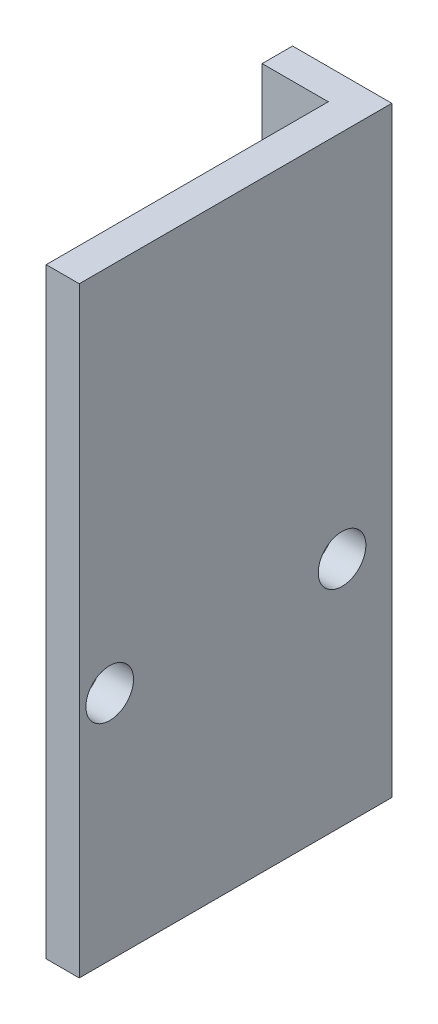
ISO-10303-21;
HEADER;
FILE_DESCRIPTION(('STEP AP214'),'2;1');
FILE_NAME('part.step','',(''),(''),'','','');
FILE_SCHEMA(('AUTOMOTIVE_DESIGN { 1 0 10303 214 1 1 1 1 }'));
ENDSEC;
DATA;
#1=APPLICATION_CONTEXT('core data for automotive mechanical design processes');
#2=APPLICATION_PROTOCOL_DEFINITION('international standard','automotive_design',2000,#1);
#3=PRODUCT_CONTEXT('',#1,'mechanical');
#4=PRODUCT('Part','Part','',(#3));
#5=PRODUCT_RELATED_PRODUCT_CATEGORY('part','',(#4));
#6=PRODUCT_DEFINITION_FORMATION('','',#4);
#7=PRODUCT_DEFINITION_CONTEXT('part definition',#1,'design');
#8=PRODUCT_DEFINITION('design','',#6,#7);
#9=PRODUCT_DEFINITION_SHAPE('','',#8);
#10=(LENGTH_UNIT() NAMED_UNIT(*) SI_UNIT(.MILLI.,.METRE.));
#11=(NAMED_UNIT(*) PLANE_ANGLE_UNIT() SI_UNIT($,.RADIAN.));
#12=(NAMED_UNIT(*) SI_UNIT($,.STERADIAN.) SOLID_ANGLE_UNIT());
#13=UNCERTAINTY_MEASURE_WITH_UNIT(LENGTH_MEASURE(1.E-05),#10,'distance_accuracy_value','');
#14=(GEOMETRIC_REPRESENTATION_CONTEXT(3) GLOBAL_UNCERTAINTY_ASSIGNED_CONTEXT((#13)) GLOBAL_UNIT_ASSIGNED_CONTEXT((#10,
#11,#12)) REPRESENTATION_CONTEXT('',''));
#15=CARTESIAN_POINT('',(0.,0.,0.));
#16=DIRECTION('',(0.,0.,1.));
#17=DIRECTION('',(1.,0.,0.));
#18=AXIS2_PLACEMENT_3D('',#15,#16,#17);
#19=CARTESIAN_POINT('',(0.,28.8544,14.9987));
#20=DIRECTION('',(1.,0.,0.));
#21=DIRECTION('',(0.,0.,-1.));
#22=AXIS2_PLACEMENT_3D('',#19,#20,#21);
#23=PLANE('',#22);
#24=CARTESIAN_POINT('',(0.,22.225,27.0764));
#25=DIRECTION('',(1.,0.,0.));
#26=DIRECTION('',(0.,-1.,0.));
#27=AXIS2_PLACEMENT_3D('',#24,#25,#26);
#28=CIRCLE('',#27,2.286);
#29=CARTESIAN_POINT('',(0.,24.511,27.0764));
#30=VERTEX_POINT('',#29);
#31=EDGE_CURVE('E118',#30,#30,#28,.T.);
#32=ORIENTED_EDGE('',*,*,#31,.T.);
#33=EDGE_LOOP('',(#32));
#34=FACE_BOUND('',#33,.T.);
#35=CARTESIAN_POINT('',(0.,22.225,4.7752));
#36=DIRECTION('',(1.,0.,0.));
#37=DIRECTION('',(0.,-1.,0.));
#38=AXIS2_PLACEMENT_3D('',#35,#36,#37);
#39=CIRCLE('',#38,2.286);
#40=CARTESIAN_POINT('',(0.,24.511,4.7752));
#41=VERTEX_POINT('',#40);
#42=EDGE_CURVE('E87',#41,#41,#39,.T.);
#43=ORIENTED_EDGE('',*,*,#42,.T.);
#44=EDGE_LOOP('',(#43));
#45=FACE_BOUND('',#44,.T.);
#46=DIRECTION('',(0.,0.,-1.));
#47=VECTOR('',#46,1.);
#48=CARTESIAN_POINT('',(0.,29.7688,7.49935));
#49=LINE('',#48,#47);
#50=CARTESIAN_POINT('',(0.,29.7688,2.921));
#51=VERTEX_POINT('',#50);
#52=CARTESIAN_POINT('',(0.,29.7688,0.));
#53=VERTEX_POINT('',#52);
#54=EDGE_CURVE('E122',#51,#53,#49,.T.);
#55=ORIENTED_EDGE('',*,*,#54,.T.);
#56=DIRECTION('',(0.,1.,0.));
#57=VECTOR('',#56,1.);
#58=CARTESIAN_POINT('',(0.,0.,0.));
#59=LINE('',#58,#57);
#60=CARTESIAN_POINT('',(0.,0.,0.));
#61=VERTEX_POINT('',#60);
#62=EDGE_CURVE('E27',#61,#53,#59,.T.);
#63=ORIENTED_EDGE('',*,*,#62,.F.);
#64=DIRECTION('',(0.,0.,-1.));
#65=VECTOR('',#64,1.);
#66=CARTESIAN_POINT('',(0.,0.,29.9974));
#67=LINE('',#66,#65);
#68=CARTESIAN_POINT('',(0.,0.,29.9974));
#69=VERTEX_POINT('',#68);
#70=EDGE_CURVE('E110',#69,#61,#67,.T.);
#71=ORIENTED_EDGE('',*,*,#70,.F.);
#72=DIRECTION('',(0.,-1.,0.));
#73=VECTOR('',#72,1.);
#74=CARTESIAN_POINT('',(0.,57.7088,29.9974));
#75=LINE('',#74,#73);
#76=CARTESIAN_POINT('',(0.,57.7088,29.9974));
#77=VERTEX_POINT('',#76);
#78=EDGE_CURVE('E156',#77,#69,#75,.T.);
#79=ORIENTED_EDGE('',*,*,#78,.F.);
#80=DIRECTION('',(0.,0.,1.));
#81=VECTOR('',#80,1.);
#82=CARTESIAN_POINT('',(0.,57.7088,0.));
#83=LINE('',#82,#81);
#84=CARTESIAN_POINT('',(0.,57.7088,2.921));
#85=VERTEX_POINT('',#84);
#86=EDGE_CURVE('E128',#85,#77,#83,.T.);
#87=ORIENTED_EDGE('',*,*,#86,.F.);
#88=DIRECTION('',(0.,-1.,0.));
#89=VECTOR('',#88,1.);
#90=CARTESIAN_POINT('',(0.,29.3116,2.921));
#91=LINE('',#90,#89);
#92=EDGE_CURVE('E141',#85,#51,#91,.T.);
#93=ORIENTED_EDGE('',*,*,#92,.T.);
#94=EDGE_LOOP('',(#55,#63,#71,#79,#87,#93));
#95=FACE_BOUND('',#94,.T.);
#96=ADVANCED_FACE('F16',(#34,#45,#95),#23,.F.);
#97=CARTESIAN_POINT('',(3.175,28.8544,14.9987));
#98=DIRECTION('',(1.,0.,0.));
#99=DIRECTION('',(0.,0.,-1.));
#100=AXIS2_PLACEMENT_3D('',#97,#98,#99);
#101=PLANE('',#100);
#102=DIRECTION('',(0.,1.,0.));
#103=VECTOR('',#102,1.);
#104=CARTESIAN_POINT('',(3.175,0.,0.));
#105=LINE('',#104,#103);
#106=CARTESIAN_POINT('',(3.175,0.,0.));
#107=VERTEX_POINT('',#106);
#108=CARTESIAN_POINT('',(3.175,57.7088,0.));
#109=VERTEX_POINT('',#108);
#110=EDGE_CURVE('E10',#107,#109,#105,.T.);
#111=ORIENTED_EDGE('',*,*,#110,.T.);
#112=DIRECTION('',(0.,0.,1.));
#113=VECTOR('',#112,1.);
#114=CARTESIAN_POINT('',(3.175,57.7088,0.));
#115=LINE('',#114,#113);
#116=CARTESIAN_POINT('',(3.175,57.7088,29.9974));
#117=VERTEX_POINT('',#116);
#118=EDGE_CURVE('E131',#109,#117,#115,.T.);
#119=ORIENTED_EDGE('',*,*,#118,.T.);
#120=DIRECTION('',(0.,-1.,0.));
#121=VECTOR('',#120,1.);
#122=CARTESIAN_POINT('',(3.175,57.7088,29.9974));
#123=LINE('',#122,#121);
#124=CARTESIAN_POINT('',(3.175,0.,29.9974));
#125=VERTEX_POINT('',#124);
#126=EDGE_CURVE('E102',#117,#125,#123,.T.);
#127=ORIENTED_EDGE('',*,*,#126,.T.);
#128=DIRECTION('',(0.,0.,-1.));
#129=VECTOR('',#128,1.);
#130=CARTESIAN_POINT('',(3.175,0.,29.9974));
#131=LINE('',#130,#129);
#132=EDGE_CURVE('E98',#125,#107,#131,.T.);
#133=ORIENTED_EDGE('',*,*,#132,.T.);
#134=EDGE_LOOP('',(#111,#119,#127,#133));
#135=FACE_BOUND('',#134,.T.);
#136=CARTESIAN_POINT('',(3.175,22.225,27.0764));
#137=DIRECTION('',(-1.,0.,0.));
#138=DIRECTION('',(0.,-1.,0.));
#139=AXIS2_PLACEMENT_3D('',#136,#137,#138);
#140=CIRCLE('',#139,2.286);
#141=CARTESIAN_POINT('',(3.175,24.511,27.0764));
#142=VERTEX_POINT('',#141);
#143=EDGE_CURVE('E133',#142,#142,#140,.T.);
#144=ORIENTED_EDGE('',*,*,#143,.T.);
#145=EDGE_LOOP('',(#144));
#146=FACE_BOUND('',#145,.T.);
#147=CARTESIAN_POINT('',(3.175,22.225,4.7752));
#148=DIRECTION('',(-1.,0.,0.));
#149=DIRECTION('',(0.,-1.,0.));
#150=AXIS2_PLACEMENT_3D('',#147,#148,#149);
#151=CIRCLE('',#150,2.286);
#152=CARTESIAN_POINT('',(3.175,24.511,4.7752));
#153=VERTEX_POINT('',#152);
#154=EDGE_CURVE('E82',#153,#153,#151,.T.);
#155=ORIENTED_EDGE('',*,*,#154,.T.);
#156=EDGE_LOOP('',(#155));
#157=FACE_BOUND('',#156,.T.);
#158=ADVANCED_FACE('F99',(#135,#146,#157),#101,.T.);
#159=CARTESIAN_POINT('',(0.,0.,0.));
#160=DIRECTION('',(0.,0.,-1.));
#161=DIRECTION('',(0.,1.,0.));
#162=AXIS2_PLACEMENT_3D('',#159,#160,#161);
#163=PLANE('',#162);
#164=ORIENTED_EDGE('',*,*,#62,.T.);
#165=DIRECTION('',(-1.,0.,0.));
#166=VECTOR('',#165,1.);
#167=CARTESIAN_POINT('',(0.,29.7688,0.));
#168=LINE('',#167,#166);
#169=CARTESIAN_POINT('',(-6.35,29.7688,0.));
#170=VERTEX_POINT('',#169);
#171=EDGE_CURVE('E151',#53,#170,#168,.T.);
#172=ORIENTED_EDGE('',*,*,#171,.T.);
#173=DIRECTION('',(0.,-1.,0.));
#174=VECTOR('',#173,1.);
#175=CARTESIAN_POINT('',(-6.35,57.7088,0.));
#176=LINE('',#175,#174);
#177=CARTESIAN_POINT('',(-6.35,57.7088,0.));
#178=VERTEX_POINT('',#177);
#179=EDGE_CURVE('E125',#178,#170,#176,.T.);
#180=ORIENTED_EDGE('',*,*,#179,.F.);
#181=DIRECTION('',(1.,0.,0.));
#182=VECTOR('',#181,1.);
#183=CARTESIAN_POINT('',(0.,57.7088,0.));
#184=LINE('',#183,#182);
#185=EDGE_CURVE('E77',#178,#109,#184,.T.);
#186=ORIENTED_EDGE('',*,*,#185,.T.);
#187=ORIENTED_EDGE('',*,*,#110,.F.);
#188=DIRECTION('',(1.,0.,0.));
#189=VECTOR('',#188,1.);
#190=CARTESIAN_POINT('',(0.,0.,0.));
#191=LINE('',#190,#189);
#192=EDGE_CURVE('E94',#61,#107,#191,.T.);
#193=ORIENTED_EDGE('',*,*,#192,.F.);
#194=EDGE_LOOP('',(#164,#172,#180,#186,#187,#193));
#195=FACE_BOUND('',#194,.T.);
#196=ADVANCED_FACE('F92',(#195),#163,.T.);
#197=CARTESIAN_POINT('',(0.,57.7088,0.));
#198=DIRECTION('',(0.,1.,0.));
#199=DIRECTION('',(0.,0.,1.));
#200=AXIS2_PLACEMENT_3D('',#197,#198,#199);
#201=PLANE('',#200);
#202=ORIENTED_EDGE('',*,*,#86,.T.);
#203=DIRECTION('',(1.,0.,0.));
#204=VECTOR('',#203,1.);
#205=CARTESIAN_POINT('',(0.,57.7088,29.9974));
#206=LINE('',#205,#204);
#207=EDGE_CURVE('E132',#77,#117,#206,.T.);
#208=ORIENTED_EDGE('',*,*,#207,.T.);
#209=ORIENTED_EDGE('',*,*,#118,.F.);
#210=ORIENTED_EDGE('',*,*,#185,.F.);
#211=DIRECTION('',(0.,0.,-1.));
#212=VECTOR('',#211,1.);
#213=CARTESIAN_POINT('',(-6.35,57.7088,2.921));
#214=LINE('',#213,#212);
#215=CARTESIAN_POINT('',(-6.35,57.7088,2.921));
#216=VERTEX_POINT('',#215);
#217=EDGE_CURVE('E124',#216,#178,#214,.T.);
#218=ORIENTED_EDGE('',*,*,#217,.F.);
#219=DIRECTION('',(-1.,0.,0.));
#220=VECTOR('',#219,1.);
#221=CARTESIAN_POINT('',(0.,57.7088,2.921));
#222=LINE('',#221,#220);
#223=EDGE_CURVE('E143',#85,#216,#222,.T.);
#224=ORIENTED_EDGE('',*,*,#223,.F.);
#225=EDGE_LOOP('',(#202,#208,#209,#210,#218,#224));
#226=FACE_BOUND('',#225,.T.);
#227=ADVANCED_FACE('F195',(#226),#201,.T.);
#228=CARTESIAN_POINT('',(0.,57.7088,29.9974));
#229=DIRECTION('',(0.,0.,1.));
#230=DIRECTION('',(0.,-1.,0.));
#231=AXIS2_PLACEMENT_3D('',#228,#229,#230);
#232=PLANE('',#231);
#233=ORIENTED_EDGE('',*,*,#78,.T.);
#234=DIRECTION('',(1.,0.,0.));
#235=VECTOR('',#234,1.);
#236=CARTESIAN_POINT('',(0.,0.,29.9974));
#237=LINE('',#236,#235);
#238=EDGE_CURVE('E20',#69,#125,#237,.T.);
#239=ORIENTED_EDGE('',*,*,#238,.T.);
#240=ORIENTED_EDGE('',*,*,#126,.F.);
#241=ORIENTED_EDGE('',*,*,#207,.F.);
#242=EDGE_LOOP('',(#233,#239,#240,#241));
#243=FACE_BOUND('',#242,.T.);
#244=ADVANCED_FACE('F200',(#243),#232,.T.);
#245=CARTESIAN_POINT('',(0.,0.,29.9974));
#246=DIRECTION('',(0.,-1.,0.));
#247=DIRECTION('',(0.,0.,-1.));
#248=AXIS2_PLACEMENT_3D('',#245,#246,#247);
#249=PLANE('',#248);
#250=ORIENTED_EDGE('',*,*,#70,.T.);
#251=ORIENTED_EDGE('',*,*,#192,.T.);
#252=ORIENTED_EDGE('',*,*,#132,.F.);
#253=ORIENTED_EDGE('',*,*,#238,.F.);
#254=EDGE_LOOP('',(#250,#251,#252,#253));
#255=FACE_BOUND('',#254,.T.);
#256=ADVANCED_FACE('F108',(#255),#249,.T.);
#257=CARTESIAN_POINT('',(0.,22.225,27.0764));
#258=DIRECTION('',(-1.,0.,0.));
#259=DIRECTION('',(0.,-1.,0.));
#260=AXIS2_PLACEMENT_3D('',#257,#258,#259);
#261=CYLINDRICAL_SURFACE('',#260,2.286);
#262=ORIENTED_EDGE('',*,*,#31,.F.);
#263=EDGE_LOOP('',(#262));
#264=FACE_BOUND('',#263,.T.);
#265=ORIENTED_EDGE('',*,*,#143,.F.);
#266=EDGE_LOOP('',(#265));
#267=FACE_BOUND('',#266,.T.);
#268=ADVANCED_FACE('F231',(#264,#267),#261,.F.);
#269=CARTESIAN_POINT('',(0.,22.225,4.7752));
#270=DIRECTION('',(-1.,0.,0.));
#271=DIRECTION('',(0.,-1.,0.));
#272=AXIS2_PLACEMENT_3D('',#269,#270,#271);
#273=CYLINDRICAL_SURFACE('',#272,2.286);
#274=ORIENTED_EDGE('',*,*,#42,.F.);
#275=EDGE_LOOP('',(#274));
#276=FACE_BOUND('',#275,.T.);
#277=ORIENTED_EDGE('',*,*,#154,.F.);
#278=EDGE_LOOP('',(#277));
#279=FACE_BOUND('',#278,.T.);
#280=ADVANCED_FACE('F221',(#276,#279),#273,.F.);
#281=CARTESIAN_POINT('',(-6.35,43.7388,1.4605));
#282=DIRECTION('',(1.,0.,0.));
#283=DIRECTION('',(0.,0.,-1.));
#284=AXIS2_PLACEMENT_3D('',#281,#282,#283);
#285=PLANE('',#284);
#286=ORIENTED_EDGE('',*,*,#179,.T.);
#287=DIRECTION('',(0.,0.,1.));
#288=VECTOR('',#287,1.);
#289=CARTESIAN_POINT('',(-6.35,29.7688,0.));
#290=LINE('',#289,#288);
#291=CARTESIAN_POINT('',(-6.35,29.7688,2.921));
#292=VERTEX_POINT('',#291);
#293=EDGE_CURVE('E148',#170,#292,#290,.T.);
#294=ORIENTED_EDGE('',*,*,#293,.T.);
#295=DIRECTION('',(0.,1.,0.));
#296=VECTOR('',#295,1.);
#297=CARTESIAN_POINT('',(-6.35,29.7688,2.921));
#298=LINE('',#297,#296);
#299=EDGE_CURVE('E139',#292,#216,#298,.T.);
#300=ORIENTED_EDGE('',*,*,#299,.T.);
#301=ORIENTED_EDGE('',*,*,#217,.T.);
#302=EDGE_LOOP('',(#286,#294,#300,#301));
#303=FACE_BOUND('',#302,.T.);
#304=ADVANCED_FACE('F174',(#303),#285,.F.);
#305=CARTESIAN_POINT('',(0.,29.7688,0.));
#306=DIRECTION('',(0.,-1.,0.));
#307=DIRECTION('',(0.,0.,1.));
#308=AXIS2_PLACEMENT_3D('',#305,#306,#307);
#309=PLANE('',#308);
#310=ORIENTED_EDGE('',*,*,#54,.F.);
#311=DIRECTION('',(-1.,0.,0.));
#312=VECTOR('',#311,1.);
#313=CARTESIAN_POINT('',(0.,29.7688,2.921));
#314=LINE('',#313,#312);
#315=EDGE_CURVE('E158',#51,#292,#314,.T.);
#316=ORIENTED_EDGE('',*,*,#315,.T.);
#317=ORIENTED_EDGE('',*,*,#293,.F.);
#318=ORIENTED_EDGE('',*,*,#171,.F.);
#319=EDGE_LOOP('',(#310,#316,#317,#318));
#320=FACE_BOUND('',#319,.T.);
#321=ADVANCED_FACE('F18',(#320),#309,.T.);
#322=CARTESIAN_POINT('',(0.,29.7688,2.921));
#323=DIRECTION('',(0.,0.,1.));
#324=DIRECTION('',(0.,1.,0.));
#325=AXIS2_PLACEMENT_3D('',#322,#323,#324);
#326=PLANE('',#325);
#327=ORIENTED_EDGE('',*,*,#92,.F.);
#328=ORIENTED_EDGE('',*,*,#223,.T.);
#329=ORIENTED_EDGE('',*,*,#299,.F.);
#330=ORIENTED_EDGE('',*,*,#315,.F.);
#331=EDGE_LOOP('',(#327,#328,#329,#330));
#332=FACE_BOUND('',#331,.T.);
#333=ADVANCED_FACE('F183',(#332),#326,.T.);
#334=CLOSED_SHELL('',(#96,#158,#196,#227,#244,#256,#268,#280,#304,#321,#333));
#335=MANIFOLD_SOLID_BREP('B1',#334);
#336=ADVANCED_BREP_SHAPE_REPRESENTATION('',(#18,#335),#14);
#337=SHAPE_DEFINITION_REPRESENTATION(#9,#336);
ENDSEC;
END-ISO-10303-21;
